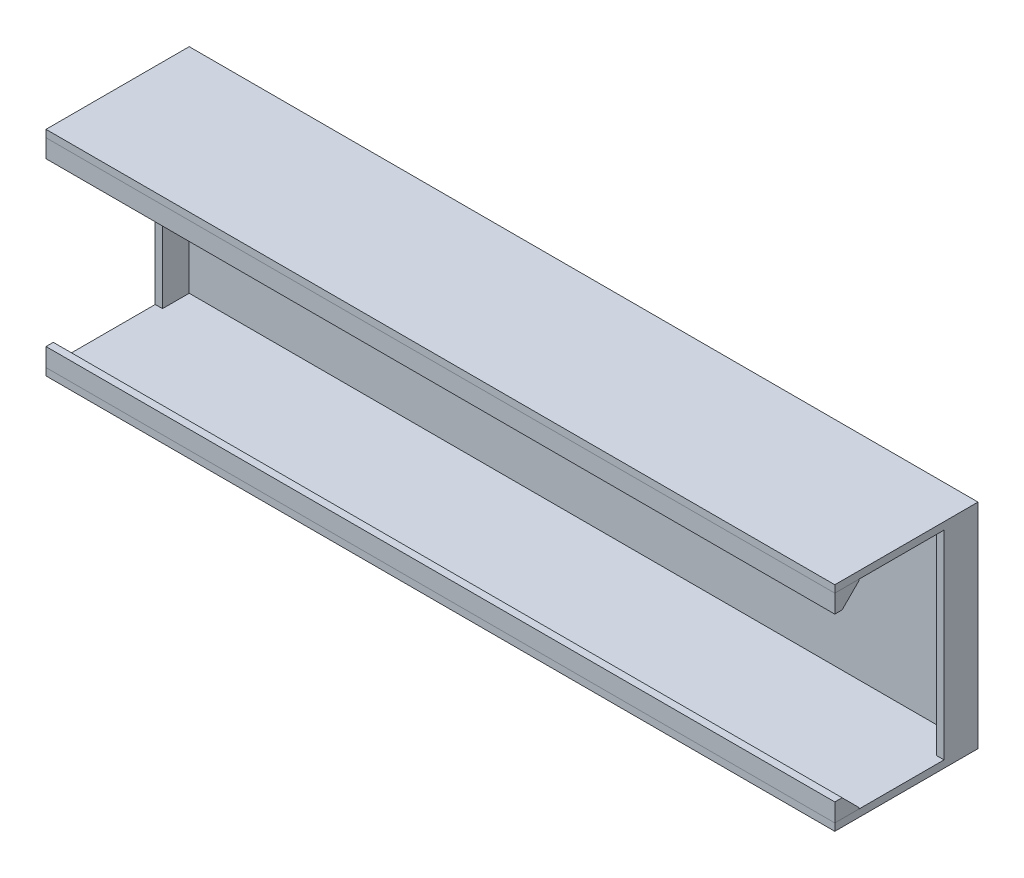
ISO-10303-21;
HEADER;
FILE_DESCRIPTION(('STEP AP214'),'2;1');
FILE_NAME('part.step','',(''),(''),'','','');
FILE_SCHEMA(('AUTOMOTIVE_DESIGN { 1 0 10303 214 1 1 1 1 }'));
ENDSEC;
DATA;
#1=APPLICATION_CONTEXT('core data for automotive mechanical design processes');
#2=APPLICATION_PROTOCOL_DEFINITION('international standard','automotive_design',2000,#1);
#3=PRODUCT_CONTEXT('',#1,'mechanical');
#4=PRODUCT('Part','Part','',(#3));
#5=PRODUCT_RELATED_PRODUCT_CATEGORY('part','',(#4));
#6=PRODUCT_DEFINITION_FORMATION('','',#4);
#7=PRODUCT_DEFINITION_CONTEXT('part definition',#1,'design');
#8=PRODUCT_DEFINITION('design','',#6,#7);
#9=PRODUCT_DEFINITION_SHAPE('','',#8);
#10=(LENGTH_UNIT() NAMED_UNIT(*) SI_UNIT(.MILLI.,.METRE.));
#11=(NAMED_UNIT(*) PLANE_ANGLE_UNIT() SI_UNIT($,.RADIAN.));
#12=(NAMED_UNIT(*) SI_UNIT($,.STERADIAN.) SOLID_ANGLE_UNIT());
#13=UNCERTAINTY_MEASURE_WITH_UNIT(LENGTH_MEASURE(1.E-05),#10,'distance_accuracy_value','');
#14=(GEOMETRIC_REPRESENTATION_CONTEXT(3) GLOBAL_UNCERTAINTY_ASSIGNED_CONTEXT((#13)) GLOBAL_UNIT_ASSIGNED_CONTEXT((#10,
#11,#12)) REPRESENTATION_CONTEXT('',''));
#15=CARTESIAN_POINT('',(0.,0.,0.));
#16=DIRECTION('',(0.,0.,1.));
#17=DIRECTION('',(1.,0.,0.));
#18=AXIS2_PLACEMENT_3D('',#15,#16,#17);
#19=CARTESIAN_POINT('',(-32.5,-8.20000000000001,9.8));
#20=DIRECTION('',(-1.,0.,0.));
#21=DIRECTION('',(0.,0.,1.));
#22=AXIS2_PLACEMENT_3D('',#19,#20,#21);
#23=PLANE('',#22);
#24=DIRECTION('',(0.,0.,1.));
#25=VECTOR('',#24,1.);
#26=CARTESIAN_POINT('',(-32.5,-6.69999999999999,9.8));
#27=LINE('',#26,#25);
#28=CARTESIAN_POINT('',(-32.5,-6.69999999999999,11.2));
#29=VERTEX_POINT('',#28);
#30=CARTESIAN_POINT('',(-32.5,-6.69999999999999,11.8));
#31=VERTEX_POINT('',#30);
#32=EDGE_CURVE('E121',#29,#31,#27,.T.);
#33=ORIENTED_EDGE('',*,*,#32,.F.);
#34=DIRECTION('',(0.,0.707106781186549,0.707106781186546));
#35=VECTOR('',#34,1.);
#36=CARTESIAN_POINT('',(-32.5,-8.15,9.75));
#37=LINE('',#36,#35);
#38=CARTESIAN_POINT('',(-32.5,-8.1,9.8));
#39=VERTEX_POINT('',#38);
#40=EDGE_CURVE('E70',#29,#39,#37,.F.);
#41=ORIENTED_EDGE('',*,*,#40,.T.);
#42=DIRECTION('',(0.,-1.,0.));
#43=VECTOR('',#42,1.);
#44=CARTESIAN_POINT('',(-32.5,-8.20000000000001,9.8));
#45=LINE('',#44,#43);
#46=CARTESIAN_POINT('',(-32.5,-8.20000000000001,9.8));
#47=VERTEX_POINT('',#46);
#48=EDGE_CURVE('E91',#39,#47,#45,.T.);
#49=ORIENTED_EDGE('',*,*,#48,.T.);
#50=DIRECTION('',(0.,0.,1.));
#51=VECTOR('',#50,1.);
#52=CARTESIAN_POINT('',(-32.5,-8.20000000000001,9.8));
#53=LINE('',#52,#51);
#54=CARTESIAN_POINT('',(-32.5,-8.20000000000001,11.8));
#55=VERTEX_POINT('',#54);
#56=EDGE_CURVE('E94',#47,#55,#53,.T.);
#57=ORIENTED_EDGE('',*,*,#56,.T.);
#58=DIRECTION('',(0.,-1.,0.));
#59=VECTOR('',#58,1.);
#60=CARTESIAN_POINT('',(-32.5,-8.20000000000001,11.8));
#61=LINE('',#60,#59);
#62=EDGE_CURVE('E113',#31,#55,#61,.T.);
#63=ORIENTED_EDGE('',*,*,#62,.F.);
#64=EDGE_LOOP('',(#33,#41,#49,#57,#63));
#65=FACE_BOUND('',#64,.T.);
#66=ADVANCED_FACE('F48',(#65),#23,.T.);
#67=CARTESIAN_POINT('',(-32.5,-6.69999999999999,9.8));
#68=DIRECTION('',(0.,1.,0.));
#69=DIRECTION('',(0.,0.,1.));
#70=AXIS2_PLACEMENT_3D('',#67,#68,#69);
#71=PLANE('',#70);
#72=DIRECTION('',(0.,0.,1.));
#73=VECTOR('',#72,1.);
#74=CARTESIAN_POINT('',(32.5,-6.69999999999999,9.8));
#75=LINE('',#74,#73);
#76=CARTESIAN_POINT('',(32.5,-6.69999999999999,11.2));
#77=VERTEX_POINT('',#76);
#78=CARTESIAN_POINT('',(32.5,-6.69999999999999,11.8));
#79=VERTEX_POINT('',#78);
#80=EDGE_CURVE('E124',#77,#79,#75,.T.);
#81=ORIENTED_EDGE('',*,*,#80,.F.);
#82=DIRECTION('',(-1.,0.,0.));
#83=VECTOR('',#82,1.);
#84=CARTESIAN_POINT('',(-32.5,-6.69999999999999,11.2));
#85=LINE('',#84,#83);
#86=EDGE_CURVE('E123',#77,#29,#85,.T.);
#87=ORIENTED_EDGE('',*,*,#86,.T.);
#88=ORIENTED_EDGE('',*,*,#32,.T.);
#89=DIRECTION('',(-1.,0.,0.));
#90=VECTOR('',#89,1.);
#91=CARTESIAN_POINT('',(-32.5,-6.69999999999999,11.8));
#92=LINE('',#91,#90);
#93=EDGE_CURVE('E98',#79,#31,#92,.T.);
#94=ORIENTED_EDGE('',*,*,#93,.F.);
#95=EDGE_LOOP('',(#81,#87,#88,#94));
#96=FACE_BOUND('',#95,.T.);
#97=ADVANCED_FACE('F132',(#96),#71,.T.);
#98=CARTESIAN_POINT('',(32.5,-8.20000000000001,9.8));
#99=DIRECTION('',(1.,0.,0.));
#100=DIRECTION('',(0.,0.,-1.));
#101=AXIS2_PLACEMENT_3D('',#98,#99,#100);
#102=PLANE('',#101);
#103=DIRECTION('',(0.,1.,0.));
#104=VECTOR('',#103,1.);
#105=CARTESIAN_POINT('',(32.5,-8.20000000000001,9.8));
#106=LINE('',#105,#104);
#107=CARTESIAN_POINT('',(32.5,-8.20000000000001,9.8));
#108=VERTEX_POINT('',#107);
#109=CARTESIAN_POINT('',(32.5,-8.1,9.8));
#110=VERTEX_POINT('',#109);
#111=EDGE_CURVE('E107',#108,#110,#106,.T.);
#112=ORIENTED_EDGE('',*,*,#111,.T.);
#113=DIRECTION('',(0.,-0.707106781186549,-0.707106781186546));
#114=VECTOR('',#113,1.);
#115=CARTESIAN_POINT('',(32.5,-8.15,9.75));
#116=LINE('',#115,#114);
#117=EDGE_CURVE('E12',#110,#77,#116,.F.);
#118=ORIENTED_EDGE('',*,*,#117,.T.);
#119=ORIENTED_EDGE('',*,*,#80,.T.);
#120=DIRECTION('',(0.,1.,0.));
#121=VECTOR('',#120,1.);
#122=CARTESIAN_POINT('',(32.5,-8.20000000000001,11.8));
#123=LINE('',#122,#121);
#124=CARTESIAN_POINT('',(32.5,-8.20000000000001,11.8));
#125=VERTEX_POINT('',#124);
#126=EDGE_CURVE('E116',#125,#79,#123,.T.);
#127=ORIENTED_EDGE('',*,*,#126,.F.);
#128=DIRECTION('',(0.,0.,1.));
#129=VECTOR('',#128,1.);
#130=CARTESIAN_POINT('',(32.5,-8.20000000000001,9.8));
#131=LINE('',#130,#129);
#132=EDGE_CURVE('E106',#108,#125,#131,.T.);
#133=ORIENTED_EDGE('',*,*,#132,.F.);
#134=EDGE_LOOP('',(#112,#118,#119,#127,#133));
#135=FACE_BOUND('',#134,.T.);
#136=ADVANCED_FACE('F140',(#135),#102,.T.);
#137=CARTESIAN_POINT('',(-32.5,-8.20000000000001,9.8));
#138=DIRECTION('',(0.,-1.,0.));
#139=DIRECTION('',(0.,0.,-1.));
#140=AXIS2_PLACEMENT_3D('',#137,#138,#139);
#141=PLANE('',#140);
#142=DIRECTION('',(1.,0.,0.));
#143=VECTOR('',#142,1.);
#144=CARTESIAN_POINT('',(-32.5,-8.20000000000001,11.8));
#145=LINE('',#144,#143);
#146=EDGE_CURVE('E104',#55,#125,#145,.T.);
#147=ORIENTED_EDGE('',*,*,#146,.F.);
#148=ORIENTED_EDGE('',*,*,#56,.F.);
#149=DIRECTION('',(1.,0.,0.));
#150=VECTOR('',#149,1.);
#151=CARTESIAN_POINT('',(-32.5,-8.20000000000001,9.8));
#152=LINE('',#151,#150);
#153=EDGE_CURVE('E97',#47,#108,#152,.T.);
#154=ORIENTED_EDGE('',*,*,#153,.T.);
#155=ORIENTED_EDGE('',*,*,#132,.T.);
#156=EDGE_LOOP('',(#147,#148,#154,#155));
#157=FACE_BOUND('',#156,.T.);
#158=ADVANCED_FACE('F102',(#157),#141,.T.);
#159=CARTESIAN_POINT('',(0.,0.,9.8));
#160=DIRECTION('',(0.,0.,-1.));
#161=DIRECTION('',(-1.,0.,0.));
#162=AXIS2_PLACEMENT_3D('',#159,#160,#161);
#163=PLANE('',#162);
#164=ORIENTED_EDGE('',*,*,#48,.F.);
#165=DIRECTION('',(1.,0.,0.));
#166=VECTOR('',#165,1.);
#167=CARTESIAN_POINT('',(0.,-8.1,9.8));
#168=LINE('',#167,#166);
#169=EDGE_CURVE('E56',#39,#110,#168,.T.);
#170=ORIENTED_EDGE('',*,*,#169,.T.);
#171=ORIENTED_EDGE('',*,*,#111,.F.);
#172=ORIENTED_EDGE('',*,*,#153,.F.);
#173=EDGE_LOOP('',(#164,#170,#171,#172));
#174=FACE_BOUND('',#173,.T.);
#175=ADVANCED_FACE('F109',(#174),#163,.T.);
#176=CARTESIAN_POINT('',(0.,0.,11.8));
#177=DIRECTION('',(0.,0.,-1.));
#178=DIRECTION('',(-1.,0.,0.));
#179=AXIS2_PLACEMENT_3D('',#176,#177,#178);
#180=PLANE('',#179);
#181=ORIENTED_EDGE('',*,*,#62,.T.);
#182=ORIENTED_EDGE('',*,*,#146,.T.);
#183=ORIENTED_EDGE('',*,*,#126,.T.);
#184=ORIENTED_EDGE('',*,*,#93,.T.);
#185=EDGE_LOOP('',(#181,#182,#183,#184));
#186=FACE_BOUND('',#185,.T.);
#187=ADVANCED_FACE('F137',(#186),#180,.F.);
#188=CARTESIAN_POINT('',(-32.5,-6.69999999999999,11.2));
#189=DIRECTION('',(0.,-0.707106781186546,0.707106781186549));
#190=DIRECTION('',(-1.,0.,0.));
#191=AXIS2_PLACEMENT_3D('',#188,#189,#190);
#192=PLANE('',#191);
#193=ORIENTED_EDGE('',*,*,#117,.F.);
#194=ORIENTED_EDGE('',*,*,#169,.F.);
#195=ORIENTED_EDGE('',*,*,#40,.F.);
#196=ORIENTED_EDGE('',*,*,#86,.F.);
#197=EDGE_LOOP('',(#193,#194,#195,#196));
#198=FACE_BOUND('',#197,.T.);
#199=ADVANCED_FACE('F50',(#198),#192,.F.);
#200=CLOSED_SHELL('',(#66,#97,#136,#158,#175,#187,#199));
#201=MANIFOLD_SOLID_BREP('B2',#200);
#202=CARTESIAN_POINT('',(-32.5,8.19999999999999,9.8));
#203=DIRECTION('',(-1.,0.,0.));
#204=DIRECTION('',(0.,0.,1.));
#205=AXIS2_PLACEMENT_3D('',#202,#203,#204);
#206=PLANE('',#205);
#207=DIRECTION('',(0.,-1.,0.));
#208=VECTOR('',#207,1.);
#209=CARTESIAN_POINT('',(-32.5,8.19999999999999,9.8));
#210=LINE('',#209,#208);
#211=CARTESIAN_POINT('',(-32.5,8.19999999999999,9.8));
#212=VERTEX_POINT('',#211);
#213=CARTESIAN_POINT('',(-32.5,8.1,9.8));
#214=VERTEX_POINT('',#213);
#215=EDGE_CURVE('E258',#212,#214,#210,.T.);
#216=ORIENTED_EDGE('',*,*,#215,.T.);
#217=DIRECTION('',(0.,-0.707106781186549,0.707106781186546));
#218=VECTOR('',#217,1.);
#219=CARTESIAN_POINT('',(-32.5,8.15,9.75000000000001));
#220=LINE('',#219,#218);
#221=CARTESIAN_POINT('',(-32.5,6.69999999999999,11.2));
#222=VERTEX_POINT('',#221);
#223=EDGE_CURVE('E46',#214,#222,#220,.T.);
#224=ORIENTED_EDGE('',*,*,#223,.T.);
#225=DIRECTION('',(0.,0.,1.));
#226=VECTOR('',#225,1.);
#227=CARTESIAN_POINT('',(-32.5,6.69999999999999,9.8));
#228=LINE('',#227,#226);
#229=CARTESIAN_POINT('',(-32.5,6.69999999999999,11.8));
#230=VERTEX_POINT('',#229);
#231=EDGE_CURVE('E270',#222,#230,#228,.T.);
#232=ORIENTED_EDGE('',*,*,#231,.T.);
#233=DIRECTION('',(0.,-1.,0.));
#234=VECTOR('',#233,1.);
#235=CARTESIAN_POINT('',(-32.5,8.19999999999999,11.8));
#236=LINE('',#235,#234);
#237=CARTESIAN_POINT('',(-32.5,8.19999999999999,11.8));
#238=VERTEX_POINT('',#237);
#239=EDGE_CURVE('E275',#238,#230,#236,.T.);
#240=ORIENTED_EDGE('',*,*,#239,.F.);
#241=DIRECTION('',(0.,0.,1.));
#242=VECTOR('',#241,1.);
#243=CARTESIAN_POINT('',(-32.5,8.19999999999999,9.8));
#244=LINE('',#243,#242);
#245=EDGE_CURVE('E266',#212,#238,#244,.T.);
#246=ORIENTED_EDGE('',*,*,#245,.F.);
#247=EDGE_LOOP('',(#216,#224,#232,#240,#246));
#248=FACE_BOUND('',#247,.T.);
#249=ADVANCED_FACE('F207',(#248),#206,.T.);
#250=CARTESIAN_POINT('',(-32.5,8.19999999999999,9.8));
#251=DIRECTION('',(0.,1.,0.));
#252=DIRECTION('',(0.,0.,1.));
#253=AXIS2_PLACEMENT_3D('',#250,#251,#252);
#254=PLANE('',#253);
#255=DIRECTION('',(-1.,0.,0.));
#256=VECTOR('',#255,1.);
#257=CARTESIAN_POINT('',(-32.5,8.19999999999999,11.8));
#258=LINE('',#257,#256);
#259=CARTESIAN_POINT('',(32.5,8.19999999999999,11.8));
#260=VERTEX_POINT('',#259);
#261=EDGE_CURVE('E265',#260,#238,#258,.T.);
#262=ORIENTED_EDGE('',*,*,#261,.F.);
#263=DIRECTION('',(0.,0.,1.));
#264=VECTOR('',#263,1.);
#265=CARTESIAN_POINT('',(32.5,8.19999999999999,9.8));
#266=LINE('',#265,#264);
#267=CARTESIAN_POINT('',(32.5,8.19999999999999,9.8));
#268=VERTEX_POINT('',#267);
#269=EDGE_CURVE('E254',#268,#260,#266,.T.);
#270=ORIENTED_EDGE('',*,*,#269,.F.);
#271=DIRECTION('',(-1.,0.,0.));
#272=VECTOR('',#271,1.);
#273=CARTESIAN_POINT('',(-32.5,8.19999999999999,9.8));
#274=LINE('',#273,#272);
#275=EDGE_CURVE('E257',#268,#212,#274,.T.);
#276=ORIENTED_EDGE('',*,*,#275,.T.);
#277=ORIENTED_EDGE('',*,*,#245,.T.);
#278=EDGE_LOOP('',(#262,#270,#276,#277));
#279=FACE_BOUND('',#278,.T.);
#280=ADVANCED_FACE('F263',(#279),#254,.T.);
#281=CARTESIAN_POINT('',(32.5,8.19999999999999,9.8));
#282=DIRECTION('',(1.,0.,0.));
#283=DIRECTION('',(0.,0.,-1.));
#284=AXIS2_PLACEMENT_3D('',#281,#282,#283);
#285=PLANE('',#284);
#286=DIRECTION('',(0.,0.,1.));
#287=VECTOR('',#286,1.);
#288=CARTESIAN_POINT('',(32.5,6.69999999999999,9.8));
#289=LINE('',#288,#287);
#290=CARTESIAN_POINT('',(32.5,6.69999999999999,11.2));
#291=VERTEX_POINT('',#290);
#292=CARTESIAN_POINT('',(32.5,6.69999999999999,11.8));
#293=VERTEX_POINT('',#292);
#294=EDGE_CURVE('E267',#291,#293,#289,.T.);
#295=ORIENTED_EDGE('',*,*,#294,.F.);
#296=DIRECTION('',(0.,0.707106781186549,-0.707106781186546));
#297=VECTOR('',#296,1.);
#298=CARTESIAN_POINT('',(32.5,8.15,9.75000000000001));
#299=LINE('',#298,#297);
#300=CARTESIAN_POINT('',(32.5,8.1,9.8));
#301=VERTEX_POINT('',#300);
#302=EDGE_CURVE('E229',#291,#301,#299,.T.);
#303=ORIENTED_EDGE('',*,*,#302,.T.);
#304=DIRECTION('',(0.,1.,0.));
#305=VECTOR('',#304,1.);
#306=CARTESIAN_POINT('',(32.5,8.19999999999999,9.8));
#307=LINE('',#306,#305);
#308=EDGE_CURVE('E250',#301,#268,#307,.T.);
#309=ORIENTED_EDGE('',*,*,#308,.T.);
#310=ORIENTED_EDGE('',*,*,#269,.T.);
#311=DIRECTION('',(0.,1.,0.));
#312=VECTOR('',#311,1.);
#313=CARTESIAN_POINT('',(32.5,8.19999999999999,11.8));
#314=LINE('',#313,#312);
#315=EDGE_CURVE('E281',#293,#260,#314,.T.);
#316=ORIENTED_EDGE('',*,*,#315,.F.);
#317=EDGE_LOOP('',(#295,#303,#309,#310,#316));
#318=FACE_BOUND('',#317,.T.);
#319=ADVANCED_FACE('F252',(#318),#285,.T.);
#320=CARTESIAN_POINT('',(-32.5,6.69999999999999,9.8));
#321=DIRECTION('',(0.,-1.,0.));
#322=DIRECTION('',(0.,0.,-1.));
#323=AXIS2_PLACEMENT_3D('',#320,#321,#322);
#324=PLANE('',#323);
#325=ORIENTED_EDGE('',*,*,#231,.F.);
#326=DIRECTION('',(1.,0.,0.));
#327=VECTOR('',#326,1.);
#328=CARTESIAN_POINT('',(32.5,6.69999999999999,11.2));
#329=LINE('',#328,#327);
#330=EDGE_CURVE('E284',#222,#291,#329,.T.);
#331=ORIENTED_EDGE('',*,*,#330,.T.);
#332=ORIENTED_EDGE('',*,*,#294,.T.);
#333=DIRECTION('',(1.,0.,0.));
#334=VECTOR('',#333,1.);
#335=CARTESIAN_POINT('',(-32.5,6.69999999999999,11.8));
#336=LINE('',#335,#334);
#337=EDGE_CURVE('E278',#230,#293,#336,.T.);
#338=ORIENTED_EDGE('',*,*,#337,.F.);
#339=EDGE_LOOP('',(#325,#331,#332,#338));
#340=FACE_BOUND('',#339,.T.);
#341=ADVANCED_FACE('F292',(#340),#324,.T.);
#342=CARTESIAN_POINT('',(0.,0.,9.8));
#343=DIRECTION('',(0.,0.,1.));
#344=DIRECTION('',(1.,0.,0.));
#345=AXIS2_PLACEMENT_3D('',#342,#343,#344);
#346=PLANE('',#345);
#347=ORIENTED_EDGE('',*,*,#308,.F.);
#348=DIRECTION('',(-1.,0.,0.));
#349=VECTOR('',#348,1.);
#350=CARTESIAN_POINT('',(-32.5,8.1,9.8));
#351=LINE('',#350,#349);
#352=EDGE_CURVE('E215',#301,#214,#351,.T.);
#353=ORIENTED_EDGE('',*,*,#352,.T.);
#354=ORIENTED_EDGE('',*,*,#215,.F.);
#355=ORIENTED_EDGE('',*,*,#275,.F.);
#356=EDGE_LOOP('',(#347,#353,#354,#355));
#357=FACE_BOUND('',#356,.T.);
#358=ADVANCED_FACE('F269',(#357),#346,.F.);
#359=CARTESIAN_POINT('',(0.,0.,11.8));
#360=DIRECTION('',(0.,0.,1.));
#361=DIRECTION('',(1.,0.,0.));
#362=AXIS2_PLACEMENT_3D('',#359,#360,#361);
#363=PLANE('',#362);
#364=ORIENTED_EDGE('',*,*,#239,.T.);
#365=ORIENTED_EDGE('',*,*,#337,.T.);
#366=ORIENTED_EDGE('',*,*,#315,.T.);
#367=ORIENTED_EDGE('',*,*,#261,.T.);
#368=EDGE_LOOP('',(#364,#365,#366,#367));
#369=FACE_BOUND('',#368,.T.);
#370=ADVANCED_FACE('F297',(#369),#363,.T.);
#371=CARTESIAN_POINT('',(-32.5,6.69999999999999,11.2));
#372=DIRECTION('',(0.,-0.707106781186546,-0.707106781186549));
#373=DIRECTION('',(-1.,0.,0.));
#374=AXIS2_PLACEMENT_3D('',#371,#372,#373);
#375=PLANE('',#374);
#376=ORIENTED_EDGE('',*,*,#223,.F.);
#377=ORIENTED_EDGE('',*,*,#352,.F.);
#378=ORIENTED_EDGE('',*,*,#302,.F.);
#379=ORIENTED_EDGE('',*,*,#330,.F.);
#380=EDGE_LOOP('',(#376,#377,#378,#379));
#381=FACE_BOUND('',#380,.T.);
#382=ADVANCED_FACE('F209',(#381),#375,.T.);
#383=CLOSED_SHELL('',(#249,#280,#319,#341,#358,#370,#382));
#384=MANIFOLD_SOLID_BREP('B6',#383);
#385=CARTESIAN_POINT('',(0.,0.,11.8));
#386=DIRECTION('',(0.,0.,1.));
#387=DIRECTION('',(1.,0.,0.));
#388=AXIS2_PLACEMENT_3D('',#385,#386,#387);
#389=PLANE('',#388);
#390=DIRECTION('',(1.,0.,0.));
#391=VECTOR('',#390,1.);
#392=CARTESIAN_POINT('',(-32.5,-8.20000000000001,11.8));
#393=LINE('',#392,#391);
#394=CARTESIAN_POINT('',(-32.5,-8.20000000000001,11.8));
#395=VERTEX_POINT('',#394);
#396=CARTESIAN_POINT('',(32.5,-8.20000000000001,11.8));
#397=VERTEX_POINT('',#396);
#398=EDGE_CURVE('E460',#395,#397,#393,.T.);
#399=ORIENTED_EDGE('',*,*,#398,.F.);
#400=DIRECTION('',(0.,-1.,0.));
#401=VECTOR('',#400,1.);
#402=CARTESIAN_POINT('',(-32.5,8.79999999999999,11.8));
#403=LINE('',#402,#401);
#404=CARTESIAN_POINT('',(-32.5,-8.80000000000001,11.8));
#405=VERTEX_POINT('',#404);
#406=EDGE_CURVE('E487',#395,#405,#403,.T.);
#407=ORIENTED_EDGE('',*,*,#406,.T.);
#408=DIRECTION('',(1.,0.,0.));
#409=VECTOR('',#408,1.);
#410=CARTESIAN_POINT('',(-32.5,-8.80000000000001,11.8));
#411=LINE('',#410,#409);
#412=CARTESIAN_POINT('',(32.5,-8.8,11.8));
#413=VERTEX_POINT('',#412);
#414=EDGE_CURVE('E381',#405,#413,#411,.T.);
#415=ORIENTED_EDGE('',*,*,#414,.T.);
#416=DIRECTION('',(0.,1.,0.));
#417=VECTOR('',#416,1.);
#418=CARTESIAN_POINT('',(32.5,8.80000000000001,11.8));
#419=LINE('',#418,#417);
#420=EDGE_CURVE('E479',#413,#397,#419,.T.);
#421=ORIENTED_EDGE('',*,*,#420,.T.);
#422=EDGE_LOOP('',(#399,#407,#415,#421));
#423=FACE_BOUND('',#422,.T.);
#424=ADVANCED_FACE('F357',(#423),#389,.T.);
#425=CARTESIAN_POINT('',(32.5,8.80000000000001,11.8));
#426=DIRECTION('',(-1.,0.,0.));
#427=DIRECTION('',(0.,0.,1.));
#428=AXIS2_PLACEMENT_3D('',#425,#426,#427);
#429=PLANE('',#428);
#430=DIRECTION('',(0.,-1.,0.));
#431=VECTOR('',#430,1.);
#432=CARTESIAN_POINT('',(32.5,8.19999999999999,2.8));
#433=LINE('',#432,#431);
#434=CARTESIAN_POINT('',(32.5,8.19999999999999,2.8));
#435=VERTEX_POINT('',#434);
#436=CARTESIAN_POINT('',(32.5,-8.20000000000001,2.8));
#437=VERTEX_POINT('',#436);
#438=EDGE_CURVE('E471',#435,#437,#433,.T.);
#439=ORIENTED_EDGE('',*,*,#438,.T.);
#440=DIRECTION('',(0.,0.,1.));
#441=VECTOR('',#440,1.);
#442=CARTESIAN_POINT('',(32.5,-8.20000000000001,11.8));
#443=LINE('',#442,#441);
#444=EDGE_CURVE('E523',#437,#397,#443,.T.);
#445=ORIENTED_EDGE('',*,*,#444,.T.);
#446=ORIENTED_EDGE('',*,*,#420,.F.);
#447=DIRECTION('',(0.,0.,-1.));
#448=VECTOR('',#447,1.);
#449=CARTESIAN_POINT('',(32.5,-8.8,11.8));
#450=LINE('',#449,#448);
#451=CARTESIAN_POINT('',(32.5,-8.8,0.));
#452=VERTEX_POINT('',#451);
#453=EDGE_CURVE('E490',#413,#452,#450,.T.);
#454=ORIENTED_EDGE('',*,*,#453,.T.);
#455=DIRECTION('',(0.,1.,0.));
#456=VECTOR('',#455,1.);
#457=CARTESIAN_POINT('',(32.5,8.80000000000001,0.));
#458=LINE('',#457,#456);
#459=CARTESIAN_POINT('',(32.5,8.80000000000001,0.));
#460=VERTEX_POINT('',#459);
#461=EDGE_CURVE('E491',#452,#460,#458,.T.);
#462=ORIENTED_EDGE('',*,*,#461,.T.);
#463=DIRECTION('',(0.,0.,-1.));
#464=VECTOR('',#463,1.);
#465=CARTESIAN_POINT('',(32.5,8.80000000000001,11.8));
#466=LINE('',#465,#464);
#467=CARTESIAN_POINT('',(32.5,8.80000000000001,11.8));
#468=VERTEX_POINT('',#467);
#469=EDGE_CURVE('E478',#468,#460,#466,.T.);
#470=ORIENTED_EDGE('',*,*,#469,.F.);
#471=CARTESIAN_POINT('',(32.5,8.19999999999999,11.8));
#472=VERTEX_POINT('',#471);
#473=EDGE_CURVE('E410',#472,#468,#419,.T.);
#474=ORIENTED_EDGE('',*,*,#473,.F.);
#475=DIRECTION('',(0.,0.,-1.));
#476=VECTOR('',#475,1.);
#477=CARTESIAN_POINT('',(32.5,8.19999999999999,11.8));
#478=LINE('',#477,#476);
#479=EDGE_CURVE('E464',#472,#435,#478,.T.);
#480=ORIENTED_EDGE('',*,*,#479,.T.);
#481=EDGE_LOOP('',(#439,#445,#446,#454,#462,#470,#474,#480));
#482=FACE_BOUND('',#481,.T.);
#483=ADVANCED_FACE('F475',(#482),#429,.F.);
#484=CARTESIAN_POINT('',(-32.5,8.79999999999999,11.8));
#485=DIRECTION('',(0.,-1.,0.));
#486=DIRECTION('',(1.,0.,0.));
#487=AXIS2_PLACEMENT_3D('',#484,#485,#486);
#488=PLANE('',#487);
#489=DIRECTION('',(-1.,0.,0.));
#490=VECTOR('',#489,1.);
#491=CARTESIAN_POINT('',(-32.5,8.79999999999999,0.));
#492=LINE('',#491,#490);
#493=CARTESIAN_POINT('',(-32.5,8.79999999999999,0.));
#494=VERTEX_POINT('',#493);
#495=EDGE_CURVE('E493',#460,#494,#492,.T.);
#496=ORIENTED_EDGE('',*,*,#495,.T.);
#497=DIRECTION('',(0.,0.,-1.));
#498=VECTOR('',#497,1.);
#499=CARTESIAN_POINT('',(-32.5,8.79999999999999,11.8));
#500=LINE('',#499,#498);
#501=CARTESIAN_POINT('',(-32.5,8.79999999999999,11.8));
#502=VERTEX_POINT('',#501);
#503=EDGE_CURVE('E500',#502,#494,#500,.T.);
#504=ORIENTED_EDGE('',*,*,#503,.F.);
#505=DIRECTION('',(-1.,0.,0.));
#506=VECTOR('',#505,1.);
#507=CARTESIAN_POINT('',(-32.5,8.79999999999999,11.8));
#508=LINE('',#507,#506);
#509=EDGE_CURVE('E481',#468,#502,#508,.T.);
#510=ORIENTED_EDGE('',*,*,#509,.F.);
#511=ORIENTED_EDGE('',*,*,#469,.T.);
#512=EDGE_LOOP('',(#496,#504,#510,#511));
#513=FACE_BOUND('',#512,.T.);
#514=ADVANCED_FACE('F598',(#513),#488,.F.);
#515=CARTESIAN_POINT('',(-32.5,8.79999999999999,11.8));
#516=DIRECTION('',(1.,0.,0.));
#517=DIRECTION('',(0.,0.,-1.));
#518=AXIS2_PLACEMENT_3D('',#515,#516,#517);
#519=PLANE('',#518);
#520=ORIENTED_EDGE('',*,*,#406,.F.);
#521=DIRECTION('',(0.,0.,1.));
#522=VECTOR('',#521,1.);
#523=CARTESIAN_POINT('',(-32.5,-8.20000000000001,11.8));
#524=LINE('',#523,#522);
#525=CARTESIAN_POINT('',(-32.5,-8.20000000000001,2.8));
#526=VERTEX_POINT('',#525);
#527=EDGE_CURVE('E472',#526,#395,#524,.T.);
#528=ORIENTED_EDGE('',*,*,#527,.F.);
#529=DIRECTION('',(0.,-1.,0.));
#530=VECTOR('',#529,1.);
#531=CARTESIAN_POINT('',(-32.5,8.19999999999999,2.8));
#532=LINE('',#531,#530);
#533=CARTESIAN_POINT('',(-32.5,8.19999999999999,2.8));
#534=VERTEX_POINT('',#533);
#535=EDGE_CURVE('E527',#534,#526,#532,.T.);
#536=ORIENTED_EDGE('',*,*,#535,.F.);
#537=DIRECTION('',(0.,0.,-1.));
#538=VECTOR('',#537,1.);
#539=CARTESIAN_POINT('',(-32.5,8.19999999999999,11.8));
#540=LINE('',#539,#538);
#541=CARTESIAN_POINT('',(-32.5,8.19999999999999,11.8));
#542=VERTEX_POINT('',#541);
#543=EDGE_CURVE('E519',#542,#534,#540,.T.);
#544=ORIENTED_EDGE('',*,*,#543,.F.);
#545=EDGE_CURVE('E458',#502,#542,#403,.T.);
#546=ORIENTED_EDGE('',*,*,#545,.F.);
#547=ORIENTED_EDGE('',*,*,#503,.T.);
#548=DIRECTION('',(0.,-1.,0.));
#549=VECTOR('',#548,1.);
#550=CARTESIAN_POINT('',(-32.5,8.79999999999999,0.));
#551=LINE('',#550,#549);
#552=CARTESIAN_POINT('',(-32.5,-8.80000000000001,0.));
#553=VERTEX_POINT('',#552);
#554=EDGE_CURVE('E482',#494,#553,#551,.T.);
#555=ORIENTED_EDGE('',*,*,#554,.T.);
#556=DIRECTION('',(0.,0.,-1.));
#557=VECTOR('',#556,1.);
#558=CARTESIAN_POINT('',(-32.5,-8.80000000000001,11.8));
#559=LINE('',#558,#557);
#560=EDGE_CURVE('E498',#405,#553,#559,.T.);
#561=ORIENTED_EDGE('',*,*,#560,.F.);
#562=EDGE_LOOP('',(#520,#528,#536,#544,#546,#547,#555,#561));
#563=FACE_BOUND('',#562,.T.);
#564=ADVANCED_FACE('F579',(#563),#519,.F.);
#565=CARTESIAN_POINT('',(-32.5,-8.80000000000001,11.8));
#566=DIRECTION('',(0.,1.,0.));
#567=DIRECTION('',(-1.,0.,0.));
#568=AXIS2_PLACEMENT_3D('',#565,#566,#567);
#569=PLANE('',#568);
#570=DIRECTION('',(1.,0.,0.));
#571=VECTOR('',#570,1.);
#572=CARTESIAN_POINT('',(-32.5,-8.80000000000001,0.));
#573=LINE('',#572,#571);
#574=EDGE_CURVE('E402',#553,#452,#573,.T.);
#575=ORIENTED_EDGE('',*,*,#574,.T.);
#576=ORIENTED_EDGE('',*,*,#453,.F.);
#577=ORIENTED_EDGE('',*,*,#414,.F.);
#578=ORIENTED_EDGE('',*,*,#560,.T.);
#579=EDGE_LOOP('',(#575,#576,#577,#578));
#580=FACE_BOUND('',#579,.T.);
#581=ADVANCED_FACE('F604',(#580),#569,.F.);
#582=DIRECTION('',(-1.,0.,0.));
#583=VECTOR('',#582,1.);
#584=CARTESIAN_POINT('',(-32.5,8.19999999999999,11.8));
#585=LINE('',#584,#583);
#586=EDGE_CURVE('E454',#472,#542,#585,.T.);
#587=ORIENTED_EDGE('',*,*,#586,.F.);
#588=ORIENTED_EDGE('',*,*,#473,.T.);
#589=ORIENTED_EDGE('',*,*,#509,.T.);
#590=ORIENTED_EDGE('',*,*,#545,.T.);
#591=EDGE_LOOP('',(#587,#588,#589,#590));
#592=FACE_BOUND('',#591,.T.);
#593=ADVANCED_FACE('F456',(#592),#389,.T.);
#594=CARTESIAN_POINT('',(0.,0.,0.));
#595=DIRECTION('',(0.,0.,1.));
#596=DIRECTION('',(1.,0.,0.));
#597=AXIS2_PLACEMENT_3D('',#594,#595,#596);
#598=PLANE('',#597);
#599=CARTESIAN_POINT('',(10.,0.,0.));
#600=DIRECTION('',(0.,0.,-1.));
#601=DIRECTION('',(-1.,0.,0.));
#602=AXIS2_PLACEMENT_3D('',#599,#600,#601);
#603=CIRCLE('',#602,2.75);
#604=CARTESIAN_POINT('',(7.25,0.,0.));
#605=VERTEX_POINT('',#604);
#606=EDGE_CURVE('E516',#605,#605,#603,.T.);
#607=ORIENTED_EDGE('',*,*,#606,.F.);
#608=EDGE_LOOP('',(#607));
#609=FACE_BOUND('',#608,.T.);
#610=CARTESIAN_POINT('',(-9.99999999999999,0.,0.));
#611=DIRECTION('',(0.,0.,-1.));
#612=DIRECTION('',(1.,0.,0.));
#613=AXIS2_PLACEMENT_3D('',#610,#611,#612);
#614=CIRCLE('',#613,2.75);
#615=CARTESIAN_POINT('',(-7.24999999999999,0.,0.));
#616=VERTEX_POINT('',#615);
#617=EDGE_CURVE('E514',#616,#616,#614,.T.);
#618=ORIENTED_EDGE('',*,*,#617,.F.);
#619=EDGE_LOOP('',(#618));
#620=FACE_BOUND('',#619,.T.);
#621=ORIENTED_EDGE('',*,*,#461,.F.);
#622=ORIENTED_EDGE('',*,*,#574,.F.);
#623=ORIENTED_EDGE('',*,*,#554,.F.);
#624=ORIENTED_EDGE('',*,*,#495,.F.);
#625=EDGE_LOOP('',(#621,#622,#623,#624));
#626=FACE_BOUND('',#625,.T.);
#627=ADVANCED_FACE('F603',(#609,#620,#626),#598,.F.);
#628=CARTESIAN_POINT('',(31.9,8.80000000000001,11.8));
#629=DIRECTION('',(-1.,0.,0.));
#630=DIRECTION('',(0.,0.,1.));
#631=AXIS2_PLACEMENT_3D('',#628,#629,#630);
#632=PLANE('',#631);
#633=DIRECTION('',(0.,-1.,0.));
#634=VECTOR('',#633,1.);
#635=CARTESIAN_POINT('',(31.9,8.80000000000001,2.8));
#636=LINE('',#635,#634);
#637=CARTESIAN_POINT('',(31.9,8.19999999999999,2.8));
#638=VERTEX_POINT('',#637);
#639=CARTESIAN_POINT('',(31.9,-8.20000000000001,2.8));
#640=VERTEX_POINT('',#639);
#641=EDGE_CURVE('E539',#638,#640,#636,.T.);
#642=ORIENTED_EDGE('',*,*,#641,.F.);
#643=DIRECTION('',(0.,0.,-1.));
#644=VECTOR('',#643,1.);
#645=CARTESIAN_POINT('',(31.9,8.20000000000002,11.8));
#646=LINE('',#645,#644);
#647=CARTESIAN_POINT('',(31.9,8.20000000000002,0.6));
#648=VERTEX_POINT('',#647);
#649=EDGE_CURVE('E494',#638,#648,#646,.T.);
#650=ORIENTED_EDGE('',*,*,#649,.T.);
#651=DIRECTION('',(0.,1.,0.));
#652=VECTOR('',#651,1.);
#653=CARTESIAN_POINT('',(31.9,8.80000000000001,0.6));
#654=LINE('',#653,#652);
#655=CARTESIAN_POINT('',(31.9,-8.2,0.6));
#656=VERTEX_POINT('',#655);
#657=EDGE_CURVE('E541',#656,#648,#654,.T.);
#658=ORIENTED_EDGE('',*,*,#657,.F.);
#659=DIRECTION('',(0.,0.,-1.));
#660=VECTOR('',#659,1.);
#661=CARTESIAN_POINT('',(31.9,-8.2,11.8));
#662=LINE('',#661,#660);
#663=EDGE_CURVE('E547',#640,#656,#662,.T.);
#664=ORIENTED_EDGE('',*,*,#663,.F.);
#665=EDGE_LOOP('',(#642,#650,#658,#664));
#666=FACE_BOUND('',#665,.T.);
#667=ADVANCED_FACE('F566',(#666),#632,.T.);
#668=CARTESIAN_POINT('',(-32.5,8.19999999999999,11.8));
#669=DIRECTION('',(0.,-1.,0.));
#670=DIRECTION('',(1.,0.,0.));
#671=AXIS2_PLACEMENT_3D('',#668,#669,#670);
#672=PLANE('',#671);
#673=ORIENTED_EDGE('',*,*,#649,.F.);
#674=DIRECTION('',(-1.,0.,0.));
#675=VECTOR('',#674,1.);
#676=CARTESIAN_POINT('',(32.5,8.19999999999999,2.8));
#677=LINE('',#676,#675);
#678=EDGE_CURVE('E467',#435,#638,#677,.T.);
#679=ORIENTED_EDGE('',*,*,#678,.F.);
#680=ORIENTED_EDGE('',*,*,#479,.F.);
#681=ORIENTED_EDGE('',*,*,#586,.T.);
#682=ORIENTED_EDGE('',*,*,#543,.T.);
#683=CARTESIAN_POINT('',(-31.9,8.19999999999999,2.8));
#684=VERTEX_POINT('',#683);
#685=EDGE_CURVE('E372',#684,#534,#677,.T.);
#686=ORIENTED_EDGE('',*,*,#685,.F.);
#687=DIRECTION('',(0.,0.,-1.));
#688=VECTOR('',#687,1.);
#689=CARTESIAN_POINT('',(-31.9,8.19999999999999,11.8));
#690=LINE('',#689,#688);
#691=CARTESIAN_POINT('',(-31.9,8.19999999999999,0.6));
#692=VERTEX_POINT('',#691);
#693=EDGE_CURVE('E546',#684,#692,#690,.T.);
#694=ORIENTED_EDGE('',*,*,#693,.T.);
#695=DIRECTION('',(-1.,0.,0.));
#696=VECTOR('',#695,1.);
#697=CARTESIAN_POINT('',(-32.5,8.19999999999999,0.6));
#698=LINE('',#697,#696);
#699=EDGE_CURVE('E544',#648,#692,#698,.T.);
#700=ORIENTED_EDGE('',*,*,#699,.F.);
#701=EDGE_LOOP('',(#673,#679,#680,#681,#682,#686,#694,#700));
#702=FACE_BOUND('',#701,.T.);
#703=ADVANCED_FACE('F466',(#702),#672,.T.);
#704=CARTESIAN_POINT('',(-31.9,8.79999999999999,11.8));
#705=DIRECTION('',(1.,0.,0.));
#706=DIRECTION('',(0.,0.,-1.));
#707=AXIS2_PLACEMENT_3D('',#704,#705,#706);
#708=PLANE('',#707);
#709=DIRECTION('',(0.,1.,0.));
#710=VECTOR('',#709,1.);
#711=CARTESIAN_POINT('',(-31.9,8.79999999999999,2.8));
#712=LINE('',#711,#710);
#713=CARTESIAN_POINT('',(-31.9,-8.20000000000001,2.8));
#714=VERTEX_POINT('',#713);
#715=EDGE_CURVE('E535',#714,#684,#712,.T.);
#716=ORIENTED_EDGE('',*,*,#715,.F.);
#717=DIRECTION('',(0.,0.,-1.));
#718=VECTOR('',#717,1.);
#719=CARTESIAN_POINT('',(-31.9,-8.20000000000001,11.8));
#720=LINE('',#719,#718);
#721=CARTESIAN_POINT('',(-31.9,-8.20000000000001,0.6));
#722=VERTEX_POINT('',#721);
#723=EDGE_CURVE('E549',#714,#722,#720,.T.);
#724=ORIENTED_EDGE('',*,*,#723,.T.);
#725=DIRECTION('',(0.,-1.,0.));
#726=VECTOR('',#725,1.);
#727=CARTESIAN_POINT('',(-31.9,8.79999999999999,0.6));
#728=LINE('',#727,#726);
#729=EDGE_CURVE('E552',#692,#722,#728,.T.);
#730=ORIENTED_EDGE('',*,*,#729,.F.);
#731=ORIENTED_EDGE('',*,*,#693,.F.);
#732=EDGE_LOOP('',(#716,#724,#730,#731));
#733=FACE_BOUND('',#732,.T.);
#734=ADVANCED_FACE('F571',(#733),#708,.T.);
#735=CARTESIAN_POINT('',(-32.5,-8.20000000000001,11.8));
#736=DIRECTION('',(0.,1.,0.));
#737=DIRECTION('',(-1.,0.,0.));
#738=AXIS2_PLACEMENT_3D('',#735,#736,#737);
#739=PLANE('',#738);
#740=ORIENTED_EDGE('',*,*,#723,.F.);
#741=DIRECTION('',(-1.,0.,0.));
#742=VECTOR('',#741,1.);
#743=CARTESIAN_POINT('',(32.5,-8.20000000000001,2.8));
#744=LINE('',#743,#742);
#745=EDGE_CURVE('E536',#714,#526,#744,.T.);
#746=ORIENTED_EDGE('',*,*,#745,.T.);
#747=ORIENTED_EDGE('',*,*,#527,.T.);
#748=ORIENTED_EDGE('',*,*,#398,.T.);
#749=ORIENTED_EDGE('',*,*,#444,.F.);
#750=EDGE_CURVE('E532',#437,#640,#744,.T.);
#751=ORIENTED_EDGE('',*,*,#750,.T.);
#752=ORIENTED_EDGE('',*,*,#663,.T.);
#753=DIRECTION('',(1.,0.,0.));
#754=VECTOR('',#753,1.);
#755=CARTESIAN_POINT('',(-32.5,-8.20000000000001,0.6));
#756=LINE('',#755,#754);
#757=EDGE_CURVE('E461',#722,#656,#756,.T.);
#758=ORIENTED_EDGE('',*,*,#757,.F.);
#759=EDGE_LOOP('',(#740,#746,#747,#748,#749,#751,#752,#758));
#760=FACE_BOUND('',#759,.T.);
#761=ADVANCED_FACE('F572',(#760),#739,.T.);
#762=CARTESIAN_POINT('',(0.,0.,0.6));
#763=DIRECTION('',(0.,0.,1.));
#764=DIRECTION('',(1.,0.,0.));
#765=AXIS2_PLACEMENT_3D('',#762,#763,#764);
#766=PLANE('',#765);
#767=CARTESIAN_POINT('',(10.,0.,0.6));
#768=DIRECTION('',(0.,0.,1.));
#769=DIRECTION('',(1.,0.,0.));
#770=AXIS2_PLACEMENT_3D('',#767,#768,#769);
#771=CIRCLE('',#770,4.17828568570857);
#772=CARTESIAN_POINT('',(14.1782856857086,0.,0.6));
#773=VERTEX_POINT('',#772);
#774=EDGE_CURVE('E205',#773,#773,#771,.F.);
#775=ORIENTED_EDGE('',*,*,#774,.T.);
#776=EDGE_LOOP('',(#775));
#777=FACE_BOUND('',#776,.T.);
#778=CARTESIAN_POINT('',(-9.99999999999999,0.,0.6));
#779=DIRECTION('',(0.,0.,1.));
#780=DIRECTION('',(1.,0.,0.));
#781=AXIS2_PLACEMENT_3D('',#778,#779,#780);
#782=CIRCLE('',#781,4.17828568570857);
#783=CARTESIAN_POINT('',(-5.82171431429142,0.,0.6));
#784=VERTEX_POINT('',#783);
#785=EDGE_CURVE('E365',#784,#784,#782,.F.);
#786=ORIENTED_EDGE('',*,*,#785,.T.);
#787=EDGE_LOOP('',(#786));
#788=FACE_BOUND('',#787,.T.);
#789=ORIENTED_EDGE('',*,*,#657,.T.);
#790=ORIENTED_EDGE('',*,*,#699,.T.);
#791=ORIENTED_EDGE('',*,*,#729,.T.);
#792=ORIENTED_EDGE('',*,*,#757,.T.);
#793=EDGE_LOOP('',(#789,#790,#791,#792));
#794=FACE_BOUND('',#793,.T.);
#795=ADVANCED_FACE('F506',(#777,#788,#794),#766,.T.);
#796=CARTESIAN_POINT('',(32.5,8.19999999999999,2.8));
#797=DIRECTION('',(0.,0.,-1.));
#798=DIRECTION('',(0.,1.,0.));
#799=AXIS2_PLACEMENT_3D('',#796,#797,#798);
#800=PLANE('',#799);
#801=ORIENTED_EDGE('',*,*,#715,.T.);
#802=ORIENTED_EDGE('',*,*,#685,.T.);
#803=ORIENTED_EDGE('',*,*,#535,.T.);
#804=ORIENTED_EDGE('',*,*,#745,.F.);
#805=EDGE_LOOP('',(#801,#802,#803,#804));
#806=FACE_BOUND('',#805,.T.);
#807=ADVANCED_FACE('F577',(#806),#800,.F.);
#808=ORIENTED_EDGE('',*,*,#641,.T.);
#809=ORIENTED_EDGE('',*,*,#750,.F.);
#810=ORIENTED_EDGE('',*,*,#438,.F.);
#811=ORIENTED_EDGE('',*,*,#678,.T.);
#812=EDGE_LOOP('',(#808,#809,#810,#811));
#813=FACE_BOUND('',#812,.T.);
#814=ADVANCED_FACE('F584',(#813),#800,.F.);
#815=CARTESIAN_POINT('',(10.,0.,-1.4));
#816=DIRECTION('',(0.,0.,1.));
#817=DIRECTION('',(1.,0.,0.));
#818=AXIS2_PLACEMENT_3D('',#815,#816,#817);
#819=TOROIDAL_SURFACE('',#818,4.17828568570857,2.);
#820=ORIENTED_EDGE('',*,*,#774,.F.);
#821=EDGE_LOOP('',(#820));
#822=FACE_BOUND('',#821,.T.);
#823=ORIENTED_EDGE('',*,*,#606,.T.);
#824=EDGE_LOOP('',(#823));
#825=FACE_BOUND('',#824,.T.);
#826=ADVANCED_FACE('F511',(#822,#825),#819,.T.);
#827=CARTESIAN_POINT('',(-9.99999999999999,0.,-1.4));
#828=DIRECTION('',(0.,0.,1.));
#829=DIRECTION('',(1.,0.,0.));
#830=AXIS2_PLACEMENT_3D('',#827,#828,#829);
#831=TOROIDAL_SURFACE('',#830,4.17828568570857,2.);
#832=ORIENTED_EDGE('',*,*,#785,.F.);
#833=EDGE_LOOP('',(#832));
#834=FACE_BOUND('',#833,.T.);
#835=ORIENTED_EDGE('',*,*,#617,.T.);
#836=EDGE_LOOP('',(#835));
#837=FACE_BOUND('',#836,.T.);
#838=ADVANCED_FACE('F359',(#834,#837),#831,.T.);
#839=CLOSED_SHELL('',(#424,#483,#514,#564,#581,#593,#627,#667,#703,#734,#761,#795,#807,#814,
#826,#838));
#840=MANIFOLD_SOLID_BREP('B40',#839);
#841=ADVANCED_BREP_SHAPE_REPRESENTATION('',(#18,#201,#384,#840),#14);
#842=SHAPE_DEFINITION_REPRESENTATION(#9,#841);
ENDSEC;
END-ISO-10303-21;
